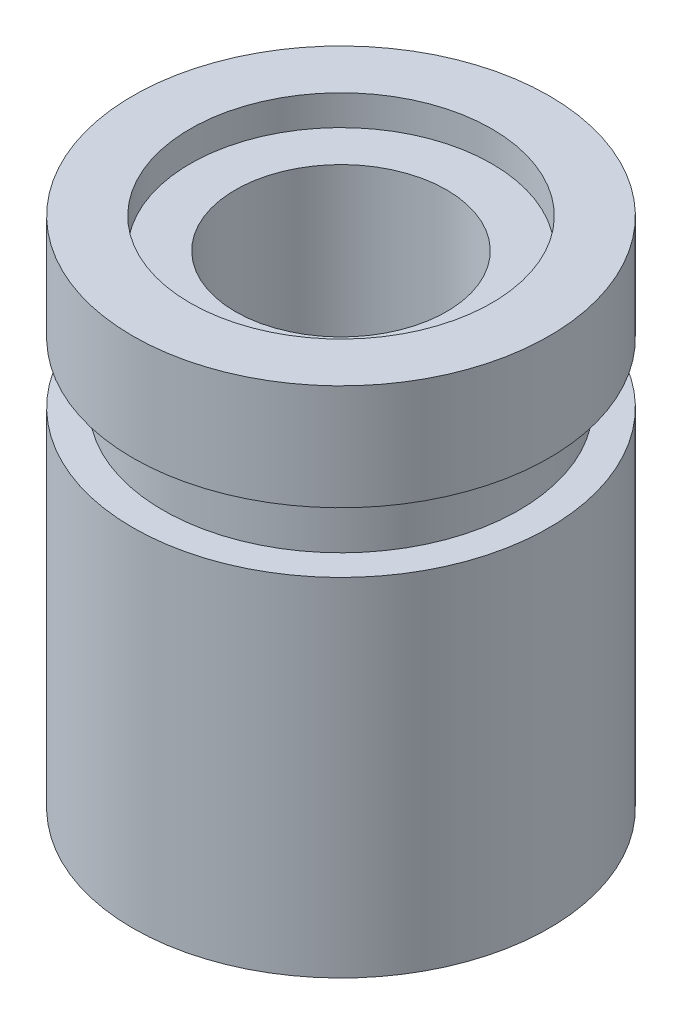
ISO-10303-21;
HEADER;
FILE_DESCRIPTION(('STEP AP214'),'2;1');
FILE_NAME('part.step','',(''),(''),'','','');
FILE_SCHEMA(('AUTOMOTIVE_DESIGN { 1 0 10303 214 1 1 1 1 }'));
ENDSEC;
DATA;
#1=APPLICATION_CONTEXT('core data for automotive mechanical design processes');
#2=APPLICATION_PROTOCOL_DEFINITION('international standard','automotive_design',2000,#1);
#3=PRODUCT_CONTEXT('',#1,'mechanical');
#4=PRODUCT('Part','Part','',(#3));
#5=PRODUCT_RELATED_PRODUCT_CATEGORY('part','',(#4));
#6=PRODUCT_DEFINITION_FORMATION('','',#4);
#7=PRODUCT_DEFINITION_CONTEXT('part definition',#1,'design');
#8=PRODUCT_DEFINITION('design','',#6,#7);
#9=PRODUCT_DEFINITION_SHAPE('','',#8);
#10=(LENGTH_UNIT() NAMED_UNIT(*) SI_UNIT(.MILLI.,.METRE.));
#11=(NAMED_UNIT(*) PLANE_ANGLE_UNIT() SI_UNIT($,.RADIAN.));
#12=(NAMED_UNIT(*) SI_UNIT($,.STERADIAN.) SOLID_ANGLE_UNIT());
#13=UNCERTAINTY_MEASURE_WITH_UNIT(LENGTH_MEASURE(1.E-05),#10,'distance_accuracy_value','');
#14=(GEOMETRIC_REPRESENTATION_CONTEXT(3) GLOBAL_UNCERTAINTY_ASSIGNED_CONTEXT((#13)) GLOBAL_UNIT_ASSIGNED_CONTEXT((#10,
#11,#12)) REPRESENTATION_CONTEXT('',''));
#15=CARTESIAN_POINT('',(0.,0.,0.));
#16=DIRECTION('',(0.,0.,1.));
#17=DIRECTION('',(1.,0.,0.));
#18=AXIS2_PLACEMENT_3D('',#15,#16,#17);
#19=CARTESIAN_POINT('',(0.,17.,0.));
#20=DIRECTION('',(0.,-1.,0.));
#21=DIRECTION('',(0.,0.,-1.));
#22=AXIS2_PLACEMENT_3D('',#19,#20,#21);
#23=CYLINDRICAL_SURFACE('',#22,6.9);
#24=CARTESIAN_POINT('',(0.,17.,0.));
#25=DIRECTION('',(0.,1.,0.));
#26=DIRECTION('',(0.,0.,1.));
#27=AXIS2_PLACEMENT_3D('',#24,#25,#26);
#28=CIRCLE('',#27,6.9);
#29=CARTESIAN_POINT('',(0.,17.,6.9));
#30=VERTEX_POINT('',#29);
#31=EDGE_CURVE('E10',#30,#30,#28,.T.);
#32=ORIENTED_EDGE('',*,*,#31,.F.);
#33=EDGE_LOOP('',(#32));
#34=FACE_BOUND('',#33,.T.);
#35=CARTESIAN_POINT('',(0.,13.5,0.));
#36=DIRECTION('',(0.,-1.,0.));
#37=DIRECTION('',(0.,0.,-1.));
#38=AXIS2_PLACEMENT_3D('',#35,#36,#37);
#39=CIRCLE('',#38,6.9);
#40=CARTESIAN_POINT('',(0.,13.5,-6.9));
#41=VERTEX_POINT('',#40);
#42=EDGE_CURVE('E41',#41,#41,#39,.T.);
#43=ORIENTED_EDGE('',*,*,#42,.F.);
#44=EDGE_LOOP('',(#43));
#45=FACE_BOUND('',#44,.T.);
#46=ADVANCED_FACE('F37',(#34,#45),#23,.T.);
#47=CARTESIAN_POINT('',(0.,8.5,0.));
#48=DIRECTION('',(0.,1.,0.));
#49=DIRECTION('',(0.,0.,1.));
#50=AXIS2_PLACEMENT_3D('',#47,#48,#49);
#51=CYLINDRICAL_SURFACE('',#50,3.5);
#52=CARTESIAN_POINT('',(0.,8.5,0.));
#53=DIRECTION('',(0.,1.,0.));
#54=DIRECTION('',(0.,0.,1.));
#55=AXIS2_PLACEMENT_3D('',#52,#53,#54);
#56=CIRCLE('',#55,3.5);
#57=CARTESIAN_POINT('',(0.,8.5,3.5));
#58=VERTEX_POINT('',#57);
#59=EDGE_CURVE('E58',#58,#58,#56,.T.);
#60=ORIENTED_EDGE('',*,*,#59,.F.);
#61=EDGE_LOOP('',(#60));
#62=FACE_BOUND('',#61,.T.);
#63=CARTESIAN_POINT('',(0.,16.,0.));
#64=DIRECTION('',(0.,1.,0.));
#65=DIRECTION('',(0.,0.,1.));
#66=AXIS2_PLACEMENT_3D('',#63,#64,#65);
#67=CIRCLE('',#66,3.5);
#68=CARTESIAN_POINT('',(0.,16.,3.5));
#69=VERTEX_POINT('',#68);
#70=EDGE_CURVE('E59',#69,#69,#67,.F.);
#71=ORIENTED_EDGE('',*,*,#70,.F.);
#72=EDGE_LOOP('',(#71));
#73=FACE_BOUND('',#72,.T.);
#74=ADVANCED_FACE('F85',(#62,#73),#51,.F.);
#75=CARTESIAN_POINT('',(0.,17.,0.));
#76=DIRECTION('',(0.,-1.,0.));
#77=DIRECTION('',(0.,0.,-1.));
#78=AXIS2_PLACEMENT_3D('',#75,#76,#77);
#79=CYLINDRICAL_SURFACE('',#78,2.5);
#80=CARTESIAN_POINT('',(0.,0.,0.));
#81=DIRECTION('',(0.,1.,0.));
#82=DIRECTION('',(0.,0.,1.));
#83=AXIS2_PLACEMENT_3D('',#80,#81,#82);
#84=CIRCLE('',#83,2.5);
#85=CARTESIAN_POINT('',(0.,0.,2.5));
#86=VERTEX_POINT('',#85);
#87=EDGE_CURVE('E50',#86,#86,#84,.T.);
#88=ORIENTED_EDGE('',*,*,#87,.F.);
#89=EDGE_LOOP('',(#88));
#90=FACE_BOUND('',#89,.T.);
#91=CARTESIAN_POINT('',(0.,8.5,0.));
#92=DIRECTION('',(0.,1.,0.));
#93=DIRECTION('',(0.,0.,1.));
#94=AXIS2_PLACEMENT_3D('',#91,#92,#93);
#95=CIRCLE('',#94,2.5);
#96=CARTESIAN_POINT('',(0.,8.5,2.5));
#97=VERTEX_POINT('',#96);
#98=EDGE_CURVE('E55',#97,#97,#95,.T.);
#99=ORIENTED_EDGE('',*,*,#98,.T.);
#100=EDGE_LOOP('',(#99));
#101=FACE_BOUND('',#100,.T.);
#102=ADVANCED_FACE('F88',(#90,#101),#79,.F.);
#103=CARTESIAN_POINT('',(0.,17.,0.));
#104=DIRECTION('',(0.,1.,0.));
#105=DIRECTION('',(0.,0.,1.));
#106=AXIS2_PLACEMENT_3D('',#103,#104,#105);
#107=PLANE('',#106);
#108=CARTESIAN_POINT('',(0.,17.,0.));
#109=DIRECTION('',(0.,1.,0.));
#110=DIRECTION('',(0.,0.,1.));
#111=AXIS2_PLACEMENT_3D('',#108,#109,#110);
#112=CIRCLE('',#111,5.);
#113=CARTESIAN_POINT('',(0.,17.,5.));
#114=VERTEX_POINT('',#113);
#115=EDGE_CURVE('E68',#114,#114,#112,.T.);
#116=ORIENTED_EDGE('',*,*,#115,.F.);
#117=EDGE_LOOP('',(#116));
#118=FACE_BOUND('',#117,.T.);
#119=ORIENTED_EDGE('',*,*,#31,.T.);
#120=EDGE_LOOP('',(#119));
#121=FACE_BOUND('',#120,.T.);
#122=ADVANCED_FACE('F119',(#118,#121),#107,.T.);
#123=CARTESIAN_POINT('',(0.,0.,0.));
#124=DIRECTION('',(0.,1.,0.));
#125=DIRECTION('',(0.,0.,1.));
#126=AXIS2_PLACEMENT_3D('',#123,#124,#125);
#127=PLANE('',#126);
#128=CARTESIAN_POINT('',(0.,0.,0.));
#129=DIRECTION('',(0.,1.,0.));
#130=DIRECTION('',(0.,0.,1.));
#131=AXIS2_PLACEMENT_3D('',#128,#129,#130);
#132=CIRCLE('',#131,6.9);
#133=CARTESIAN_POINT('',(0.,0.,6.9));
#134=VERTEX_POINT('',#133);
#135=EDGE_CURVE('E45',#134,#134,#132,.T.);
#136=ORIENTED_EDGE('',*,*,#135,.F.);
#137=EDGE_LOOP('',(#136));
#138=FACE_BOUND('',#137,.T.);
#139=ORIENTED_EDGE('',*,*,#87,.T.);
#140=EDGE_LOOP('',(#139));
#141=FACE_BOUND('',#140,.T.);
#142=ADVANCED_FACE('F114',(#138,#141),#127,.F.);
#143=CARTESIAN_POINT('',(0.,11.5,0.));
#144=DIRECTION('',(0.,-1.,0.));
#145=DIRECTION('',(0.,0.,-1.));
#146=AXIS2_PLACEMENT_3D('',#143,#144,#145);
#147=CIRCLE('',#146,6.9);
#148=CARTESIAN_POINT('',(0.,11.5,-6.9));
#149=VERTEX_POINT('',#148);
#150=EDGE_CURVE('E62',#149,#149,#147,.T.);
#151=ORIENTED_EDGE('',*,*,#150,.T.);
#152=EDGE_LOOP('',(#151));
#153=FACE_BOUND('',#152,.T.);
#154=ORIENTED_EDGE('',*,*,#135,.T.);
#155=EDGE_LOOP('',(#154));
#156=FACE_BOUND('',#155,.T.);
#157=ADVANCED_FACE('F39',(#153,#156),#23,.T.);
#158=CARTESIAN_POINT('',(0.,8.5,0.));
#159=DIRECTION('',(0.,1.,0.));
#160=DIRECTION('',(0.,0.,1.));
#161=AXIS2_PLACEMENT_3D('',#158,#159,#160);
#162=PLANE('',#161);
#163=ORIENTED_EDGE('',*,*,#98,.F.);
#164=EDGE_LOOP('',(#163));
#165=FACE_BOUND('',#164,.T.);
#166=ORIENTED_EDGE('',*,*,#59,.T.);
#167=EDGE_LOOP('',(#166));
#168=FACE_BOUND('',#167,.T.);
#169=ADVANCED_FACE('F83',(#165,#168),#162,.T.);
#170=CARTESIAN_POINT('',(0.,16.,0.));
#171=DIRECTION('',(0.,1.,0.));
#172=DIRECTION('',(0.,0.,1.));
#173=AXIS2_PLACEMENT_3D('',#170,#171,#172);
#174=PLANE('',#173);
#175=CARTESIAN_POINT('',(0.,16.,0.));
#176=DIRECTION('',(0.,1.,0.));
#177=DIRECTION('',(0.,0.,1.));
#178=AXIS2_PLACEMENT_3D('',#175,#176,#177);
#179=CIRCLE('',#178,5.);
#180=CARTESIAN_POINT('',(0.,16.,5.));
#181=VERTEX_POINT('',#180);
#182=EDGE_CURVE('E61',#181,#181,#179,.T.);
#183=ORIENTED_EDGE('',*,*,#182,.T.);
#184=EDGE_LOOP('',(#183));
#185=FACE_BOUND('',#184,.T.);
#186=ORIENTED_EDGE('',*,*,#70,.T.);
#187=EDGE_LOOP('',(#186));
#188=FACE_BOUND('',#187,.T.);
#189=ADVANCED_FACE('F92',(#185,#188),#174,.T.);
#190=CARTESIAN_POINT('',(0.,16.,0.));
#191=DIRECTION('',(0.,1.,0.));
#192=DIRECTION('',(0.,0.,1.));
#193=AXIS2_PLACEMENT_3D('',#190,#191,#192);
#194=CYLINDRICAL_SURFACE('',#193,5.);
#195=ORIENTED_EDGE('',*,*,#182,.F.);
#196=EDGE_LOOP('',(#195));
#197=FACE_BOUND('',#196,.T.);
#198=ORIENTED_EDGE('',*,*,#115,.T.);
#199=EDGE_LOOP('',(#198));
#200=FACE_BOUND('',#199,.T.);
#201=ADVANCED_FACE('F94',(#197,#200),#194,.F.);
#202=CARTESIAN_POINT('',(0.,13.5,0.));
#203=DIRECTION('',(0.,-1.,0.));
#204=DIRECTION('',(0.,0.,-1.));
#205=AXIS2_PLACEMENT_3D('',#202,#203,#204);
#206=PLANE('',#205);
#207=CARTESIAN_POINT('',(0.,13.5,0.));
#208=DIRECTION('',(0.,-1.,0.));
#209=DIRECTION('',(0.,0.,-1.));
#210=AXIS2_PLACEMENT_3D('',#207,#208,#209);
#211=CIRCLE('',#210,5.9);
#212=CARTESIAN_POINT('',(0.,13.5,-5.9));
#213=VERTEX_POINT('',#212);
#214=EDGE_CURVE('E64',#213,#213,#211,.T.);
#215=ORIENTED_EDGE('',*,*,#214,.F.);
#216=EDGE_LOOP('',(#215));
#217=FACE_BOUND('',#216,.T.);
#218=ORIENTED_EDGE('',*,*,#42,.T.);
#219=EDGE_LOOP('',(#218));
#220=FACE_BOUND('',#219,.T.);
#221=ADVANCED_FACE('F101',(#217,#220),#206,.T.);
#222=CARTESIAN_POINT('',(0.,11.5,0.));
#223=DIRECTION('',(0.,-1.,0.));
#224=DIRECTION('',(0.,0.,-1.));
#225=AXIS2_PLACEMENT_3D('',#222,#223,#224);
#226=PLANE('',#225);
#227=CARTESIAN_POINT('',(0.,11.5,0.));
#228=DIRECTION('',(0.,-1.,0.));
#229=DIRECTION('',(0.,0.,-1.));
#230=AXIS2_PLACEMENT_3D('',#227,#228,#229);
#231=CIRCLE('',#230,5.9);
#232=CARTESIAN_POINT('',(0.,11.5,-5.9));
#233=VERTEX_POINT('',#232);
#234=EDGE_CURVE('E70',#233,#233,#231,.T.);
#235=ORIENTED_EDGE('',*,*,#234,.T.);
#236=EDGE_LOOP('',(#235));
#237=FACE_BOUND('',#236,.T.);
#238=ORIENTED_EDGE('',*,*,#150,.F.);
#239=EDGE_LOOP('',(#238));
#240=FACE_BOUND('',#239,.T.);
#241=ADVANCED_FACE('F177',(#237,#240),#226,.F.);
#242=CARTESIAN_POINT('',(0.,0.,0.));
#243=DIRECTION('',(0.,-1.,0.));
#244=DIRECTION('',(0.,0.,-1.));
#245=AXIS2_PLACEMENT_3D('',#242,#243,#244);
#246=CYLINDRICAL_SURFACE('',#245,5.9);
#247=ORIENTED_EDGE('',*,*,#234,.F.);
#248=EDGE_LOOP('',(#247));
#249=FACE_BOUND('',#248,.T.);
#250=ORIENTED_EDGE('',*,*,#214,.T.);
#251=EDGE_LOOP('',(#250));
#252=FACE_BOUND('',#251,.T.);
#253=ADVANCED_FACE('F186',(#249,#252),#246,.T.);
#254=CLOSED_SHELL('',(#46,#74,#102,#122,#142,#157,#169,#189,#201,#221,#241,#253));
#255=MANIFOLD_SOLID_BREP('B2',#254);
#256=ADVANCED_BREP_SHAPE_REPRESENTATION('',(#18,#255),#14);
#257=SHAPE_DEFINITION_REPRESENTATION(#9,#256);
ENDSEC;
END-ISO-10303-21;
